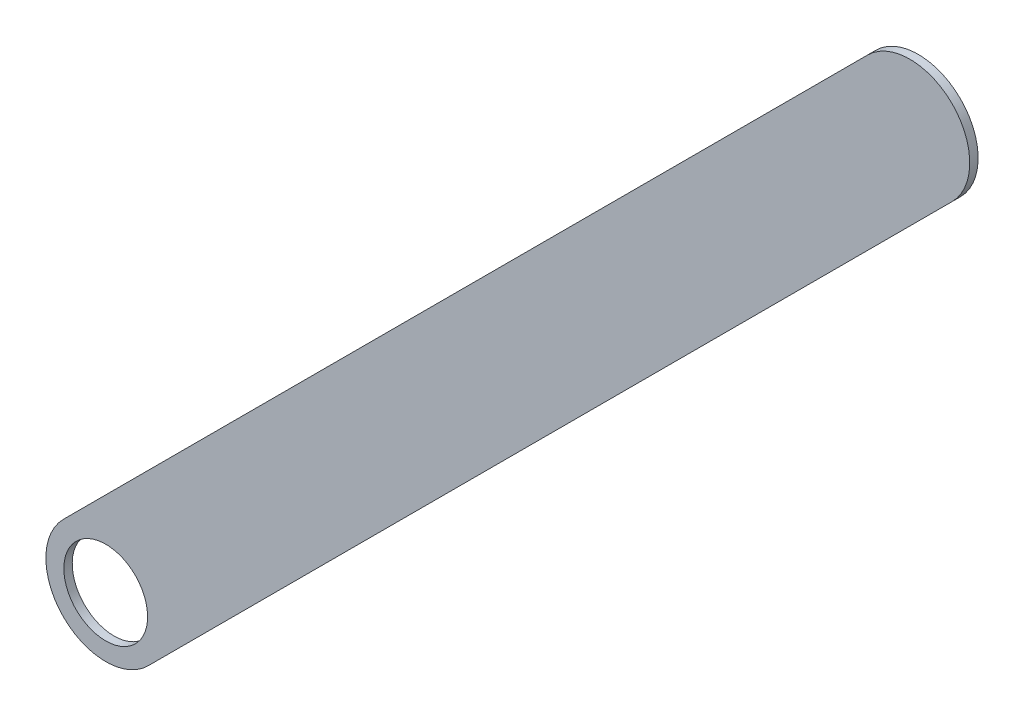
ISO-10303-21;
HEADER;
FILE_DESCRIPTION(('STEP AP214'),'2;1');
FILE_NAME('part.step','',(''),(''),'','','');
FILE_SCHEMA(('AUTOMOTIVE_DESIGN { 1 0 10303 214 1 1 1 1 }'));
ENDSEC;
DATA;
#1=APPLICATION_CONTEXT('core data for automotive mechanical design processes');
#2=APPLICATION_PROTOCOL_DEFINITION('international standard','automotive_design',2000,#1);
#3=PRODUCT_CONTEXT('',#1,'mechanical');
#4=PRODUCT('Part','Part','',(#3));
#5=PRODUCT_RELATED_PRODUCT_CATEGORY('part','',(#4));
#6=PRODUCT_DEFINITION_FORMATION('','',#4);
#7=PRODUCT_DEFINITION_CONTEXT('part definition',#1,'design');
#8=PRODUCT_DEFINITION('design','',#6,#7);
#9=PRODUCT_DEFINITION_SHAPE('','',#8);
#10=(LENGTH_UNIT() NAMED_UNIT(*) SI_UNIT(.MILLI.,.METRE.));
#11=(NAMED_UNIT(*) PLANE_ANGLE_UNIT() SI_UNIT($,.RADIAN.));
#12=(NAMED_UNIT(*) SI_UNIT($,.STERADIAN.) SOLID_ANGLE_UNIT());
#13=UNCERTAINTY_MEASURE_WITH_UNIT(LENGTH_MEASURE(1.E-05),#10,'distance_accuracy_value','');
#14=(GEOMETRIC_REPRESENTATION_CONTEXT(3) GLOBAL_UNCERTAINTY_ASSIGNED_CONTEXT((#13)) GLOBAL_UNIT_ASSIGNED_CONTEXT((#10,
#11,#12)) REPRESENTATION_CONTEXT('',''));
#15=CARTESIAN_POINT('',(0.,0.,0.));
#16=DIRECTION('',(0.,0.,1.));
#17=DIRECTION('',(1.,0.,0.));
#18=AXIS2_PLACEMENT_3D('',#15,#16,#17);
#19=CARTESIAN_POINT('',(134.3,-59.74,-0.045));
#20=DIRECTION('',(0.,0.,-1.));
#21=DIRECTION('',(0.,-1.,0.));
#22=AXIS2_PLACEMENT_3D('',#19,#20,#21);
#23=CYLINDRICAL_SURFACE('',#22,0.175);
#24=CARTESIAN_POINT('',(134.3,-59.74,1.6));
#25=DIRECTION('',(0.,0.,-1.));
#26=DIRECTION('',(0.,-1.,0.));
#27=AXIS2_PLACEMENT_3D('',#24,#25,#26);
#28=CIRCLE('',#27,0.175);
#29=CARTESIAN_POINT('',(134.3,-59.915,1.6));
#30=VERTEX_POINT('',#29);
#31=EDGE_CURVE('E86',#30,#30,#28,.T.);
#32=ORIENTED_EDGE('',*,*,#31,.T.);
#33=DIRECTION('',(0.,0.,1.));
#34=VECTOR('',#33,1.);
#35=CARTESIAN_POINT('',(134.3,-59.915,-0.045));
#36=LINE('',#35,#34);
#37=CARTESIAN_POINT('',(134.3,-59.915,1.635));
#38=VERTEX_POINT('',#37);
#39=EDGE_CURVE('E11',#30,#38,#36,.T.);
#40=ORIENTED_EDGE('',*,*,#39,.T.);
#41=CARTESIAN_POINT('',(134.3,-59.74,1.635));
#42=DIRECTION('',(0.,0.,-1.));
#43=DIRECTION('',(0.,-1.,0.));
#44=AXIS2_PLACEMENT_3D('',#41,#42,#43);
#45=CIRCLE('',#44,0.175);
#46=EDGE_CURVE('E25',#38,#38,#45,.T.);
#47=ORIENTED_EDGE('',*,*,#46,.F.);
#48=ORIENTED_EDGE('',*,*,#39,.F.);
#49=EDGE_LOOP('',(#32,#40,#47,#48));
#50=FACE_BOUND('',#49,.T.);
#51=ADVANCED_FACE('F17',(#50),#23,.F.);
#52=CARTESIAN_POINT('',(137.483223,-56.203223,1.6));
#53=DIRECTION('',(0.707106781186548,-0.707106781186548,0.));
#54=DIRECTION('',(0.,0.,-1.));
#55=AXIS2_PLACEMENT_3D('',#52,#53,#54);
#56=PLANE('',#55);
#57=DIRECTION('',(-0.707106781186548,-0.707106781186548,0.));
#58=VECTOR('',#57,1.);
#59=CARTESIAN_POINT('',(137.483223,-56.203223,1.6));
#60=LINE('',#59,#58);
#61=CARTESIAN_POINT('',(137.483223,-56.203223,1.6));
#62=VERTEX_POINT('',#61);
#63=CARTESIAN_POINT('',(134.123223,-59.563223,1.6));
#64=VERTEX_POINT('',#63);
#65=EDGE_CURVE('E75',#62,#64,#60,.T.);
#66=ORIENTED_EDGE('',*,*,#65,.T.);
#67=DIRECTION('',(0.,0.,1.));
#68=VECTOR('',#67,1.);
#69=CARTESIAN_POINT('',(134.123223,-59.563223,1.6));
#70=LINE('',#69,#68);
#71=CARTESIAN_POINT('',(134.123223,-59.563223,1.635));
#72=VERTEX_POINT('',#71);
#73=EDGE_CURVE('E78',#64,#72,#70,.T.);
#74=ORIENTED_EDGE('',*,*,#73,.T.);
#75=DIRECTION('',(-0.707106781186548,-0.707106781186548,0.));
#76=VECTOR('',#75,1.);
#77=CARTESIAN_POINT('',(137.483223,-56.203223,1.635));
#78=LINE('',#77,#76);
#79=CARTESIAN_POINT('',(137.483223,-56.203223,1.635));
#80=VERTEX_POINT('',#79);
#81=EDGE_CURVE('E122',#80,#72,#78,.T.);
#82=ORIENTED_EDGE('',*,*,#81,.F.);
#83=DIRECTION('',(0.,0.,1.));
#84=VECTOR('',#83,1.);
#85=CARTESIAN_POINT('',(137.483223,-56.203223,1.6));
#86=LINE('',#85,#84);
#87=EDGE_CURVE('E81',#62,#80,#86,.T.);
#88=ORIENTED_EDGE('',*,*,#87,.F.);
#89=EDGE_LOOP('',(#66,#74,#82,#88));
#90=FACE_BOUND('',#89,.T.);
#91=ADVANCED_FACE('F77',(#90),#56,.F.);
#92=CARTESIAN_POINT('',(134.476776,-59.916776,1.635));
#93=DIRECTION('',(0.,0.,1.));
#94=DIRECTION('',(1.,0.,0.));
#95=AXIS2_PLACEMENT_3D('',#92,#93,#94);
#96=PLANE('',#95);
#97=ORIENTED_EDGE('',*,*,#46,.T.);
#98=EDGE_LOOP('',(#97));
#99=FACE_BOUND('',#98,.T.);
#100=DIRECTION('',(0.707106781186548,0.707106781186548,0.));
#101=VECTOR('',#100,1.);
#102=CARTESIAN_POINT('',(134.476776,-59.916776,1.635));
#103=LINE('',#102,#101);
#104=CARTESIAN_POINT('',(134.476776,-59.916776,1.635));
#105=VERTEX_POINT('',#104);
#106=CARTESIAN_POINT('',(137.836776,-56.556776,1.635));
#107=VERTEX_POINT('',#106);
#108=EDGE_CURVE('E111',#105,#107,#103,.T.);
#109=ORIENTED_EDGE('',*,*,#108,.T.);
#110=CARTESIAN_POINT('',(137.6599995,-56.3799995,1.635));
#111=DIRECTION('',(0.,0.,1.));
#112=DIRECTION('',(0.707106781186548,-0.707106781186548,0.));
#113=AXIS2_PLACEMENT_3D('',#110,#111,#112);
#114=CIRCLE('',#113,0.249999723809);
#115=EDGE_CURVE('E87',#107,#80,#114,.T.);
#116=ORIENTED_EDGE('',*,*,#115,.T.);
#117=ORIENTED_EDGE('',*,*,#81,.T.);
#118=CARTESIAN_POINT('',(134.2999995,-59.7399995,1.635));
#119=DIRECTION('',(0.,0.,1.));
#120=DIRECTION('',(-0.707106781186548,0.707106781186548,0.));
#121=AXIS2_PLACEMENT_3D('',#118,#119,#120);
#122=CIRCLE('',#121,0.249999723809);
#123=EDGE_CURVE('E94',#72,#105,#122,.T.);
#124=ORIENTED_EDGE('',*,*,#123,.T.);
#125=EDGE_LOOP('',(#109,#116,#117,#124));
#126=FACE_BOUND('',#125,.T.);
#127=ADVANCED_FACE('F166',(#99,#126),#96,.T.);
#128=CARTESIAN_POINT('',(134.476776,-59.916776,1.6));
#129=DIRECTION('',(0.,0.,1.));
#130=DIRECTION('',(1.,0.,0.));
#131=AXIS2_PLACEMENT_3D('',#128,#129,#130);
#132=PLANE('',#131);
#133=ORIENTED_EDGE('',*,*,#31,.F.);
#134=EDGE_LOOP('',(#133));
#135=FACE_BOUND('',#134,.T.);
#136=CARTESIAN_POINT('',(134.2999995,-59.7399995,1.6));
#137=DIRECTION('',(0.,0.,1.));
#138=DIRECTION('',(-0.707106781186548,0.707106781186548,0.));
#139=AXIS2_PLACEMENT_3D('',#136,#137,#138);
#140=CIRCLE('',#139,0.249999723809);
#141=CARTESIAN_POINT('',(134.476776,-59.916776,1.6));
#142=VERTEX_POINT('',#141);
#143=EDGE_CURVE('E92',#64,#142,#140,.T.);
#144=ORIENTED_EDGE('',*,*,#143,.F.);
#145=ORIENTED_EDGE('',*,*,#65,.F.);
#146=CARTESIAN_POINT('',(137.6599995,-56.3799995,1.6));
#147=DIRECTION('',(0.,0.,1.));
#148=DIRECTION('',(0.707106781186548,-0.707106781186548,0.));
#149=AXIS2_PLACEMENT_3D('',#146,#147,#148);
#150=CIRCLE('',#149,0.249999723809);
#151=CARTESIAN_POINT('',(137.836776,-56.556776,1.6));
#152=VERTEX_POINT('',#151);
#153=EDGE_CURVE('E96',#152,#62,#150,.T.);
#154=ORIENTED_EDGE('',*,*,#153,.F.);
#155=DIRECTION('',(0.707106781186548,0.707106781186548,0.));
#156=VECTOR('',#155,1.);
#157=CARTESIAN_POINT('',(134.476776,-59.916776,1.6));
#158=LINE('',#157,#156);
#159=EDGE_CURVE('E101',#142,#152,#158,.T.);
#160=ORIENTED_EDGE('',*,*,#159,.F.);
#161=EDGE_LOOP('',(#144,#145,#154,#160));
#162=FACE_BOUND('',#161,.T.);
#163=ADVANCED_FACE('F99',(#135,#162),#132,.F.);
#164=CARTESIAN_POINT('',(137.6599995,-56.3799995,1.6));
#165=DIRECTION('',(0.,0.,-1.));
#166=DIRECTION('',(0.707106781186548,-0.707106781186548,0.));
#167=AXIS2_PLACEMENT_3D('',#164,#165,#166);
#168=CYLINDRICAL_SURFACE('',#167,0.249999723809);
#169=ORIENTED_EDGE('',*,*,#153,.T.);
#170=ORIENTED_EDGE('',*,*,#87,.T.);
#171=ORIENTED_EDGE('',*,*,#115,.F.);
#172=DIRECTION('',(0.,0.,1.));
#173=VECTOR('',#172,1.);
#174=CARTESIAN_POINT('',(137.836776,-56.556776,1.6));
#175=LINE('',#174,#173);
#176=EDGE_CURVE('E134',#152,#107,#175,.T.);
#177=ORIENTED_EDGE('',*,*,#176,.F.);
#178=EDGE_LOOP('',(#169,#170,#171,#177));
#179=FACE_BOUND('',#178,.T.);
#180=ADVANCED_FACE('F158',(#179),#168,.T.);
#181=CARTESIAN_POINT('',(134.2999995,-59.7399995,1.6));
#182=DIRECTION('',(0.,0.,-1.));
#183=DIRECTION('',(-0.707106781186548,0.707106781186548,0.));
#184=AXIS2_PLACEMENT_3D('',#181,#182,#183);
#185=CYLINDRICAL_SURFACE('',#184,0.249999723809);
#186=ORIENTED_EDGE('',*,*,#143,.T.);
#187=DIRECTION('',(0.,0.,1.));
#188=VECTOR('',#187,1.);
#189=CARTESIAN_POINT('',(134.476776,-59.916776,1.6));
#190=LINE('',#189,#188);
#191=EDGE_CURVE('E103',#142,#105,#190,.T.);
#192=ORIENTED_EDGE('',*,*,#191,.T.);
#193=ORIENTED_EDGE('',*,*,#123,.F.);
#194=ORIENTED_EDGE('',*,*,#73,.F.);
#195=EDGE_LOOP('',(#186,#192,#193,#194));
#196=FACE_BOUND('',#195,.T.);
#197=ADVANCED_FACE('F90',(#196),#185,.T.);
#198=CARTESIAN_POINT('',(134.476776,-59.916776,1.6));
#199=DIRECTION('',(-0.707106781186548,0.707106781186548,0.));
#200=DIRECTION('',(0.,0.,1.));
#201=AXIS2_PLACEMENT_3D('',#198,#199,#200);
#202=PLANE('',#201);
#203=ORIENTED_EDGE('',*,*,#159,.T.);
#204=ORIENTED_EDGE('',*,*,#176,.T.);
#205=ORIENTED_EDGE('',*,*,#108,.F.);
#206=ORIENTED_EDGE('',*,*,#191,.F.);
#207=EDGE_LOOP('',(#203,#204,#205,#206));
#208=FACE_BOUND('',#207,.T.);
#209=ADVANCED_FACE('F150',(#208),#202,.F.);
#210=CLOSED_SHELL('',(#51,#91,#127,#163,#180,#197,#209));
#211=MANIFOLD_SOLID_BREP('B1',#210);
#212=ADVANCED_BREP_SHAPE_REPRESENTATION('',(#18,#211),#14);
#213=SHAPE_DEFINITION_REPRESENTATION(#9,#212);
ENDSEC;
END-ISO-10303-21;
